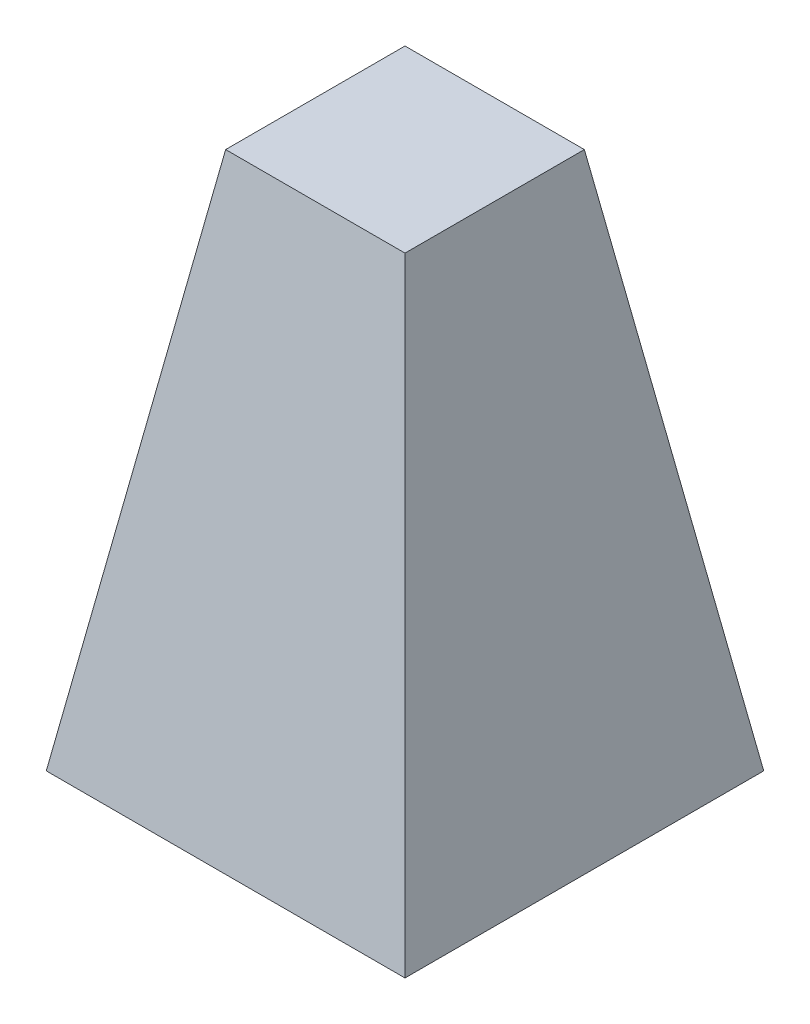
ISO-10303-21;
HEADER;
FILE_DESCRIPTION(('STEP AP214'),'2;1');
FILE_NAME('part.step','',(''),(''),'','','');
FILE_SCHEMA(('AUTOMOTIVE_DESIGN { 1 0 10303 214 1 1 1 1 }'));
ENDSEC;
DATA;
#1=APPLICATION_CONTEXT('core data for automotive mechanical design processes');
#2=APPLICATION_PROTOCOL_DEFINITION('international standard','automotive_design',2000,#1);
#3=PRODUCT_CONTEXT('',#1,'mechanical');
#4=PRODUCT('Part','Part','',(#3));
#5=PRODUCT_RELATED_PRODUCT_CATEGORY('part','',(#4));
#6=PRODUCT_DEFINITION_FORMATION('','',#4);
#7=PRODUCT_DEFINITION_CONTEXT('part definition',#1,'design');
#8=PRODUCT_DEFINITION('design','',#6,#7);
#9=PRODUCT_DEFINITION_SHAPE('','',#8);
#10=(LENGTH_UNIT() NAMED_UNIT(*) SI_UNIT(.MILLI.,.METRE.));
#11=(NAMED_UNIT(*) PLANE_ANGLE_UNIT() SI_UNIT($,.RADIAN.));
#12=(NAMED_UNIT(*) SI_UNIT($,.STERADIAN.) SOLID_ANGLE_UNIT());
#13=UNCERTAINTY_MEASURE_WITH_UNIT(LENGTH_MEASURE(1.E-05),#10,'distance_accuracy_value','');
#14=(GEOMETRIC_REPRESENTATION_CONTEXT(3) GLOBAL_UNCERTAINTY_ASSIGNED_CONTEXT((#13)) GLOBAL_UNIT_ASSIGNED_CONTEXT((#10,
#11,#12)) REPRESENTATION_CONTEXT('',''));
#15=CARTESIAN_POINT('',(0.,0.,0.));
#16=DIRECTION('',(0.,0.,1.));
#17=DIRECTION('',(1.,0.,0.));
#18=AXIS2_PLACEMENT_3D('',#15,#16,#17);
#19=CARTESIAN_POINT('',(0.,75.,0.));
#20=DIRECTION('',(0.,1.,0.));
#21=DIRECTION('',(0.,0.,1.));
#22=AXIS2_PLACEMENT_3D('',#19,#20,#21);
#23=PLANE('',#22);
#24=DIRECTION('',(0.,0.,-1.));
#25=VECTOR('',#24,1.);
#26=CARTESIAN_POINT('',(37.5,75.,-12.5));
#27=LINE('',#26,#25);
#28=CARTESIAN_POINT('',(37.5,75.,-12.5));
#29=VERTEX_POINT('',#28);
#30=CARTESIAN_POINT('',(37.5,75.,-37.5));
#31=VERTEX_POINT('',#30);
#32=EDGE_CURVE('E245',#29,#31,#27,.T.);
#33=ORIENTED_EDGE('',*,*,#32,.T.);
#34=DIRECTION('',(-1.,0.,0.));
#35=VECTOR('',#34,1.);
#36=CARTESIAN_POINT('',(37.5,75.,-37.5));
#37=LINE('',#36,#35);
#38=CARTESIAN_POINT('',(12.5,75.,-37.5));
#39=VERTEX_POINT('',#38);
#40=EDGE_CURVE('E163',#31,#39,#37,.T.);
#41=ORIENTED_EDGE('',*,*,#40,.T.);
#42=DIRECTION('',(0.,0.,1.));
#43=VECTOR('',#42,1.);
#44=CARTESIAN_POINT('',(12.5,75.,-37.5));
#45=LINE('',#44,#43);
#46=CARTESIAN_POINT('',(12.5,75.,-12.5));
#47=VERTEX_POINT('',#46);
#48=EDGE_CURVE('E53',#39,#47,#45,.T.);
#49=ORIENTED_EDGE('',*,*,#48,.T.);
#50=DIRECTION('',(1.,0.,0.));
#51=VECTOR('',#50,1.);
#52=CARTESIAN_POINT('',(12.5,75.,-12.5));
#53=LINE('',#52,#51);
#54=EDGE_CURVE('E12',#47,#29,#53,.T.);
#55=ORIENTED_EDGE('',*,*,#54,.T.);
#56=EDGE_LOOP('',(#33,#41,#49,#55));
#57=FACE_BOUND('',#56,.T.);
#58=ADVANCED_FACE('F43',(#57),#23,.T.);
#59=CARTESIAN_POINT('',(0.,0.,0.));
#60=DIRECTION('',(0.,-1.,0.));
#61=DIRECTION('',(0.,0.,-1.));
#62=AXIS2_PLACEMENT_3D('',#59,#60,#61);
#63=PLANE('',#62);
#64=DIRECTION('',(0.,0.,1.));
#65=VECTOR('',#64,1.);
#66=CARTESIAN_POINT('',(0.,0.,0.));
#67=LINE('',#66,#65);
#68=CARTESIAN_POINT('',(0.,0.,-50.));
#69=VERTEX_POINT('',#68);
#70=CARTESIAN_POINT('',(0.,0.,0.));
#71=VERTEX_POINT('',#70);
#72=EDGE_CURVE('E93',#69,#71,#67,.T.);
#73=ORIENTED_EDGE('',*,*,#72,.F.);
#74=DIRECTION('',(-1.,0.,0.));
#75=VECTOR('',#74,1.);
#76=CARTESIAN_POINT('',(0.,0.,-50.));
#77=LINE('',#76,#75);
#78=CARTESIAN_POINT('',(50.,0.,-50.));
#79=VERTEX_POINT('',#78);
#80=EDGE_CURVE('E109',#79,#69,#77,.T.);
#81=ORIENTED_EDGE('',*,*,#80,.F.);
#82=DIRECTION('',(0.,0.,-1.));
#83=VECTOR('',#82,1.);
#84=CARTESIAN_POINT('',(50.,0.,0.));
#85=LINE('',#84,#83);
#86=CARTESIAN_POINT('',(50.,0.,0.));
#87=VERTEX_POINT('',#86);
#88=EDGE_CURVE('E95',#87,#79,#85,.T.);
#89=ORIENTED_EDGE('',*,*,#88,.F.);
#90=DIRECTION('',(1.,0.,0.));
#91=VECTOR('',#90,1.);
#92=CARTESIAN_POINT('',(0.,0.,0.));
#93=LINE('',#92,#91);
#94=EDGE_CURVE('E89',#71,#87,#93,.T.);
#95=ORIENTED_EDGE('',*,*,#94,.F.);
#96=EDGE_LOOP('',(#73,#81,#89,#95));
#97=FACE_BOUND('',#96,.T.);
#98=ADVANCED_FACE('F91',(#97),#63,.T.);
#99=CARTESIAN_POINT('',(0.,0.,0.));
#100=DIRECTION('',(0.,-0.164398987305357,-0.986393923832144));
#101=DIRECTION('',(0.,0.986393923832144,-0.164398987305357));
#102=AXIS2_PLACEMENT_3D('',#99,#100,#101);
#103=PLANE('',#102);
#104=DIRECTION('',(-0.162221421130763,0.973328526784575,-0.162221421130763));
#105=VECTOR('',#104,1.);
#106=CARTESIAN_POINT('',(50.,0.,0.));
#107=LINE('',#106,#105);
#108=EDGE_CURVE('E100',#87,#29,#107,.T.);
#109=ORIENTED_EDGE('',*,*,#108,.T.);
#110=ORIENTED_EDGE('',*,*,#54,.F.);
#111=DIRECTION('',(0.162221421130763,0.973328526784575,-0.162221421130763));
#112=VECTOR('',#111,1.);
#113=CARTESIAN_POINT('',(0.,0.,0.));
#114=LINE('',#113,#112);
#115=EDGE_CURVE('E68',#71,#47,#114,.T.);
#116=ORIENTED_EDGE('',*,*,#115,.F.);
#117=ORIENTED_EDGE('',*,*,#94,.T.);
#118=EDGE_LOOP('',(#109,#110,#116,#117));
#119=FACE_BOUND('',#118,.T.);
#120=ADVANCED_FACE('F113',(#119),#103,.F.);
#121=CARTESIAN_POINT('',(0.,0.,0.));
#122=DIRECTION('',(0.986393923832144,-0.164398987305357,0.));
#123=DIRECTION('',(0.164398987305357,0.986393923832144,0.));
#124=AXIS2_PLACEMENT_3D('',#121,#122,#123);
#125=PLANE('',#124);
#126=ORIENTED_EDGE('',*,*,#115,.T.);
#127=ORIENTED_EDGE('',*,*,#48,.F.);
#128=DIRECTION('',(0.162221421130762,0.973328526784575,0.162221421130763));
#129=VECTOR('',#128,1.);
#130=CARTESIAN_POINT('',(0.,0.,-50.));
#131=LINE('',#130,#129);
#132=EDGE_CURVE('E108',#69,#39,#131,.T.);
#133=ORIENTED_EDGE('',*,*,#132,.F.);
#134=ORIENTED_EDGE('',*,*,#72,.T.);
#135=EDGE_LOOP('',(#126,#127,#133,#134));
#136=FACE_BOUND('',#135,.T.);
#137=ADVANCED_FACE('F106',(#136),#125,.F.);
#138=CARTESIAN_POINT('',(48.6486486486487,8.10810810810812,0.));
#139=DIRECTION('',(-0.986393923832144,-0.164398987305357,0.));
#140=DIRECTION('',(0.164398987305357,-0.986393923832144,0.));
#141=AXIS2_PLACEMENT_3D('',#138,#139,#140);
#142=PLANE('',#141);
#143=DIRECTION('',(-0.162221421130763,0.973328526784575,0.162221421130763));
#144=VECTOR('',#143,1.);
#145=CARTESIAN_POINT('',(50.,0.,-50.));
#146=LINE('',#145,#144);
#147=EDGE_CURVE('E115',#79,#31,#146,.T.);
#148=ORIENTED_EDGE('',*,*,#147,.T.);
#149=ORIENTED_EDGE('',*,*,#32,.F.);
#150=ORIENTED_EDGE('',*,*,#108,.F.);
#151=ORIENTED_EDGE('',*,*,#88,.T.);
#152=EDGE_LOOP('',(#148,#149,#150,#151));
#153=FACE_BOUND('',#152,.T.);
#154=ADVANCED_FACE('F136',(#153),#142,.F.);
#155=CARTESIAN_POINT('',(0.,8.10810810810812,-48.6486486486487));
#156=DIRECTION('',(0.,-0.164398987305358,0.986393923832144));
#157=DIRECTION('',(0.,-0.986393923832144,-0.164398987305358));
#158=AXIS2_PLACEMENT_3D('',#155,#156,#157);
#159=PLANE('',#158);
#160=ORIENTED_EDGE('',*,*,#132,.T.);
#161=ORIENTED_EDGE('',*,*,#40,.F.);
#162=ORIENTED_EDGE('',*,*,#147,.F.);
#163=ORIENTED_EDGE('',*,*,#80,.T.);
#164=EDGE_LOOP('',(#160,#161,#162,#163));
#165=FACE_BOUND('',#164,.T.);
#166=ADVANCED_FACE('F145',(#165),#159,.F.);
#167=CLOSED_SHELL('',(#58,#98,#120,#137,#154,#166));
#168=MANIFOLD_SOLID_BREP('B2',#167);
#169=ADVANCED_BREP_SHAPE_REPRESENTATION('',(#18,#168),#14);
#170=SHAPE_DEFINITION_REPRESENTATION(#9,#169);
ENDSEC;
END-ISO-10303-21;
